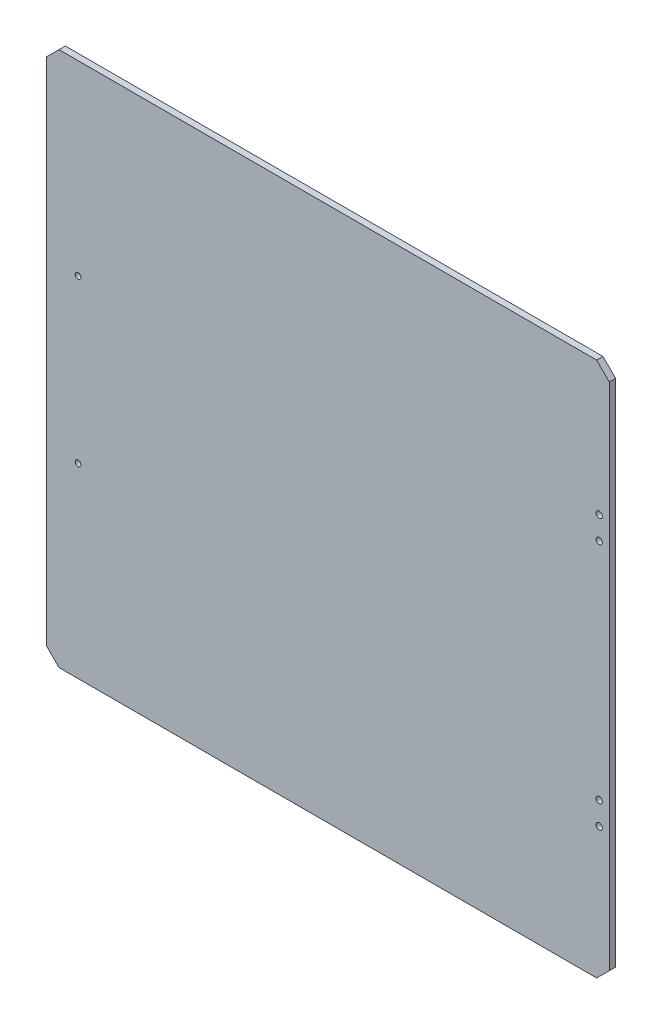
ISO-10303-21;
HEADER;
FILE_DESCRIPTION(('STEP AP214'),'2;1');
FILE_NAME('part.step','',(''),(''),'','','');
FILE_SCHEMA(('AUTOMOTIVE_DESIGN { 1 0 10303 214 1 1 1 1 }'));
ENDSEC;
DATA;
#1=APPLICATION_CONTEXT('core data for automotive mechanical design processes');
#2=APPLICATION_PROTOCOL_DEFINITION('international standard','automotive_design',2000,#1);
#3=PRODUCT_CONTEXT('',#1,'mechanical');
#4=PRODUCT('Part','Part','',(#3));
#5=PRODUCT_RELATED_PRODUCT_CATEGORY('part','',(#4));
#6=PRODUCT_DEFINITION_FORMATION('','',#4);
#7=PRODUCT_DEFINITION_CONTEXT('part definition',#1,'design');
#8=PRODUCT_DEFINITION('design','',#6,#7);
#9=PRODUCT_DEFINITION_SHAPE('','',#8);
#10=(LENGTH_UNIT() NAMED_UNIT(*) SI_UNIT(.MILLI.,.METRE.));
#11=(NAMED_UNIT(*) PLANE_ANGLE_UNIT() SI_UNIT($,.RADIAN.));
#12=(NAMED_UNIT(*) SI_UNIT($,.STERADIAN.) SOLID_ANGLE_UNIT());
#13=UNCERTAINTY_MEASURE_WITH_UNIT(LENGTH_MEASURE(1.E-05),#10,'distance_accuracy_value','');
#14=(GEOMETRIC_REPRESENTATION_CONTEXT(3) GLOBAL_UNCERTAINTY_ASSIGNED_CONTEXT((#13)) GLOBAL_UNIT_ASSIGNED_CONTEXT((#10,
#11,#12)) REPRESENTATION_CONTEXT('',''));
#15=CARTESIAN_POINT('',(0.,0.,0.));
#16=DIRECTION('',(0.,0.,1.));
#17=DIRECTION('',(1.,0.,0.));
#18=AXIS2_PLACEMENT_3D('',#15,#16,#17);
#19=CARTESIAN_POINT('',(0.,0.,5.));
#20=DIRECTION('',(0.,0.,1.));
#21=DIRECTION('',(1.,0.,0.));
#22=AXIS2_PLACEMENT_3D('',#19,#20,#21);
#23=PLANE('',#22);
#24=CARTESIAN_POINT('',(-197.,64.,5.));
#25=DIRECTION('',(0.,0.,1.));
#26=DIRECTION('',(1.,0.,0.));
#27=AXIS2_PLACEMENT_3D('',#24,#25,#26);
#28=CIRCLE('',#27,2.25000000000001);
#29=CARTESIAN_POINT('',(-194.75,64.,5.));
#30=VERTEX_POINT('',#29);
#31=EDGE_CURVE('E202',#30,#30,#28,.T.);
#32=ORIENTED_EDGE('',*,*,#31,.F.);
#33=EDGE_LOOP('',(#32));
#34=FACE_BOUND('',#33,.T.);
#35=CARTESIAN_POINT('',(214.,-88.4404340682116,5.));
#36=DIRECTION('',(0.,0.,1.));
#37=DIRECTION('',(-1.,0.,0.));
#38=AXIS2_PLACEMENT_3D('',#35,#36,#37);
#39=CIRCLE('',#38,2.5);
#40=CARTESIAN_POINT('',(211.5,-88.4404340682116,5.));
#41=VERTEX_POINT('',#40);
#42=EDGE_CURVE('E190',#41,#41,#39,.T.);
#43=ORIENTED_EDGE('',*,*,#42,.F.);
#44=EDGE_LOOP('',(#43));
#45=FACE_BOUND('',#44,.T.);
#46=CARTESIAN_POINT('',(214.,106.440434068212,5.));
#47=DIRECTION('',(0.,0.,1.));
#48=DIRECTION('',(1.,0.,0.));
#49=AXIS2_PLACEMENT_3D('',#46,#47,#48);
#50=CIRCLE('',#49,2.5);
#51=CARTESIAN_POINT('',(216.5,106.440434068212,5.));
#52=VERTEX_POINT('',#51);
#53=EDGE_CURVE('E136',#52,#52,#50,.T.);
#54=ORIENTED_EDGE('',*,*,#53,.F.);
#55=EDGE_LOOP('',(#54));
#56=FACE_BOUND('',#55,.T.);
#57=DIRECTION('',(0.,-1.,0.));
#58=VECTOR('',#57,1.);
#59=CARTESIAN_POINT('',(-222.,-201.,5.));
#60=LINE('',#59,#58);
#61=CARTESIAN_POINT('',(-222.,201.,5.));
#62=VERTEX_POINT('',#61);
#63=CARTESIAN_POINT('',(-222.,-201.,5.));
#64=VERTEX_POINT('',#63);
#65=EDGE_CURVE('E147',#62,#64,#60,.T.);
#66=ORIENTED_EDGE('',*,*,#65,.T.);
#67=DIRECTION('',(0.707106781186547,-0.707106781186547,0.));
#68=VECTOR('',#67,1.);
#69=CARTESIAN_POINT('',(-212.,-211.,5.));
#70=LINE('',#69,#68);
#71=CARTESIAN_POINT('',(-212.,-211.,5.));
#72=VERTEX_POINT('',#71);
#73=EDGE_CURVE('E95',#64,#72,#70,.T.);
#74=ORIENTED_EDGE('',*,*,#73,.T.);
#75=DIRECTION('',(1.,0.,0.));
#76=VECTOR('',#75,1.);
#77=CARTESIAN_POINT('',(212.,-211.,5.));
#78=LINE('',#77,#76);
#79=CARTESIAN_POINT('',(212.,-211.,5.));
#80=VERTEX_POINT('',#79);
#81=EDGE_CURVE('E162',#72,#80,#78,.T.);
#82=ORIENTED_EDGE('',*,*,#81,.T.);
#83=DIRECTION('',(0.707106781186547,0.707106781186547,0.));
#84=VECTOR('',#83,1.);
#85=CARTESIAN_POINT('',(212.,-211.,5.));
#86=LINE('',#85,#84);
#87=CARTESIAN_POINT('',(222.,-201.,5.));
#88=VERTEX_POINT('',#87);
#89=EDGE_CURVE('E175',#80,#88,#86,.T.);
#90=ORIENTED_EDGE('',*,*,#89,.T.);
#91=DIRECTION('',(0.,1.,0.));
#92=VECTOR('',#91,1.);
#93=CARTESIAN_POINT('',(222.,-201.,5.));
#94=LINE('',#93,#92);
#95=CARTESIAN_POINT('',(222.,201.,5.));
#96=VERTEX_POINT('',#95);
#97=EDGE_CURVE('E114',#88,#96,#94,.T.);
#98=ORIENTED_EDGE('',*,*,#97,.T.);
#99=DIRECTION('',(-0.707106781186547,0.707106781186547,0.));
#100=VECTOR('',#99,1.);
#101=CARTESIAN_POINT('',(222.,201.,5.));
#102=LINE('',#101,#100);
#103=CARTESIAN_POINT('',(212.,211.,5.));
#104=VERTEX_POINT('',#103);
#105=EDGE_CURVE('E108',#96,#104,#102,.T.);
#106=ORIENTED_EDGE('',*,*,#105,.T.);
#107=DIRECTION('',(-1.,0.,0.));
#108=VECTOR('',#107,1.);
#109=CARTESIAN_POINT('',(212.,211.,5.));
#110=LINE('',#109,#108);
#111=CARTESIAN_POINT('',(-212.,211.,5.));
#112=VERTEX_POINT('',#111);
#113=EDGE_CURVE('E112',#104,#112,#110,.T.);
#114=ORIENTED_EDGE('',*,*,#113,.T.);
#115=DIRECTION('',(-0.707106781186547,-0.707106781186547,0.));
#116=VECTOR('',#115,1.);
#117=CARTESIAN_POINT('',(-222.,201.,5.));
#118=LINE('',#117,#116);
#119=EDGE_CURVE('E52',#112,#62,#118,.T.);
#120=ORIENTED_EDGE('',*,*,#119,.T.);
#121=EDGE_LOOP('',(#66,#74,#82,#90,#98,#106,#114,#120));
#122=FACE_BOUND('',#121,.T.);
#123=CARTESIAN_POINT('',(214.,88.4404340682115,5.));
#124=DIRECTION('',(0.,0.,1.));
#125=DIRECTION('',(1.,0.,0.));
#126=AXIS2_PLACEMENT_3D('',#123,#124,#125);
#127=CIRCLE('',#126,2.5);
#128=CARTESIAN_POINT('',(216.5,88.4404340682115,5.));
#129=VERTEX_POINT('',#128);
#130=EDGE_CURVE('E184',#129,#129,#127,.T.);
#131=ORIENTED_EDGE('',*,*,#130,.F.);
#132=EDGE_LOOP('',(#131));
#133=FACE_BOUND('',#132,.T.);
#134=CARTESIAN_POINT('',(214.,-106.440434068212,5.));
#135=DIRECTION('',(0.,0.,1.));
#136=DIRECTION('',(-1.,0.,0.));
#137=AXIS2_PLACEMENT_3D('',#134,#135,#136);
#138=CIRCLE('',#137,2.5);
#139=CARTESIAN_POINT('',(211.5,-106.440434068212,5.));
#140=VERTEX_POINT('',#139);
#141=EDGE_CURVE('E196',#140,#140,#138,.T.);
#142=ORIENTED_EDGE('',*,*,#141,.F.);
#143=EDGE_LOOP('',(#142));
#144=FACE_BOUND('',#143,.T.);
#145=CARTESIAN_POINT('',(-197.,-64.,5.));
#146=DIRECTION('',(0.,0.,1.));
#147=DIRECTION('',(-1.,0.,0.));
#148=AXIS2_PLACEMENT_3D('',#145,#146,#147);
#149=CIRCLE('',#148,2.25000000000001);
#150=CARTESIAN_POINT('',(-199.25,-64.,5.));
#151=VERTEX_POINT('',#150);
#152=EDGE_CURVE('E208',#151,#151,#149,.T.);
#153=ORIENTED_EDGE('',*,*,#152,.F.);
#154=EDGE_LOOP('',(#153));
#155=FACE_BOUND('',#154,.T.);
#156=ADVANCED_FACE('F35',(#34,#45,#56,#122,#133,#144,#155),#23,.T.);
#157=CARTESIAN_POINT('',(0.,0.,0.));
#158=DIRECTION('',(0.,0.,1.));
#159=DIRECTION('',(1.,0.,0.));
#160=AXIS2_PLACEMENT_3D('',#157,#158,#159);
#161=PLANE('',#160);
#162=CARTESIAN_POINT('',(-197.,64.,0.));
#163=DIRECTION('',(0.,0.,1.));
#164=DIRECTION('',(1.,0.,0.));
#165=AXIS2_PLACEMENT_3D('',#162,#163,#164);
#166=CIRCLE('',#165,2.25000000000001);
#167=CARTESIAN_POINT('',(-194.75,64.,0.));
#168=VERTEX_POINT('',#167);
#169=EDGE_CURVE('E205',#168,#168,#166,.T.);
#170=ORIENTED_EDGE('',*,*,#169,.T.);
#171=EDGE_LOOP('',(#170));
#172=FACE_BOUND('',#171,.T.);
#173=CARTESIAN_POINT('',(214.,-88.4404340682116,0.));
#174=DIRECTION('',(0.,0.,1.));
#175=DIRECTION('',(-1.,0.,0.));
#176=AXIS2_PLACEMENT_3D('',#173,#174,#175);
#177=CIRCLE('',#176,2.5);
#178=CARTESIAN_POINT('',(211.5,-88.4404340682116,0.));
#179=VERTEX_POINT('',#178);
#180=EDGE_CURVE('E193',#179,#179,#177,.T.);
#181=ORIENTED_EDGE('',*,*,#180,.T.);
#182=EDGE_LOOP('',(#181));
#183=FACE_BOUND('',#182,.T.);
#184=CARTESIAN_POINT('',(214.,106.440434068212,0.));
#185=DIRECTION('',(0.,0.,1.));
#186=DIRECTION('',(1.,0.,0.));
#187=AXIS2_PLACEMENT_3D('',#184,#185,#186);
#188=CIRCLE('',#187,2.5);
#189=CARTESIAN_POINT('',(216.5,106.440434068212,0.));
#190=VERTEX_POINT('',#189);
#191=EDGE_CURVE('E181',#190,#190,#188,.T.);
#192=ORIENTED_EDGE('',*,*,#191,.T.);
#193=EDGE_LOOP('',(#192));
#194=FACE_BOUND('',#193,.T.);
#195=DIRECTION('',(0.,-1.,0.));
#196=VECTOR('',#195,1.);
#197=CARTESIAN_POINT('',(-222.,-201.,0.));
#198=LINE('',#197,#196);
#199=CARTESIAN_POINT('',(-222.,201.,0.));
#200=VERTEX_POINT('',#199);
#201=CARTESIAN_POINT('',(-222.,-201.,0.));
#202=VERTEX_POINT('',#201);
#203=EDGE_CURVE('E132',#200,#202,#198,.T.);
#204=ORIENTED_EDGE('',*,*,#203,.F.);
#205=DIRECTION('',(-0.707106781186547,-0.707106781186547,0.));
#206=VECTOR('',#205,1.);
#207=CARTESIAN_POINT('',(-222.,201.,0.));
#208=LINE('',#207,#206);
#209=CARTESIAN_POINT('',(-212.,211.,0.));
#210=VERTEX_POINT('',#209);
#211=EDGE_CURVE('E87',#210,#200,#208,.T.);
#212=ORIENTED_EDGE('',*,*,#211,.F.);
#213=DIRECTION('',(-1.,0.,0.));
#214=VECTOR('',#213,1.);
#215=CARTESIAN_POINT('',(212.,211.,0.));
#216=LINE('',#215,#214);
#217=CARTESIAN_POINT('',(212.,211.,0.));
#218=VERTEX_POINT('',#217);
#219=EDGE_CURVE('E81',#218,#210,#216,.T.);
#220=ORIENTED_EDGE('',*,*,#219,.F.);
#221=DIRECTION('',(-0.707106781186547,0.707106781186547,0.));
#222=VECTOR('',#221,1.);
#223=CARTESIAN_POINT('',(222.,201.,0.));
#224=LINE('',#223,#222);
#225=CARTESIAN_POINT('',(222.,201.,0.));
#226=VERTEX_POINT('',#225);
#227=EDGE_CURVE('E122',#226,#218,#224,.T.);
#228=ORIENTED_EDGE('',*,*,#227,.F.);
#229=DIRECTION('',(0.,1.,0.));
#230=VECTOR('',#229,1.);
#231=CARTESIAN_POINT('',(222.,-201.,0.));
#232=LINE('',#231,#230);
#233=CARTESIAN_POINT('',(222.,-201.,0.));
#234=VERTEX_POINT('',#233);
#235=EDGE_CURVE('E142',#234,#226,#232,.T.);
#236=ORIENTED_EDGE('',*,*,#235,.F.);
#237=DIRECTION('',(0.707106781186547,0.707106781186547,0.));
#238=VECTOR('',#237,1.);
#239=CARTESIAN_POINT('',(212.,-211.,0.));
#240=LINE('',#239,#238);
#241=CARTESIAN_POINT('',(212.,-211.,0.));
#242=VERTEX_POINT('',#241);
#243=EDGE_CURVE('E140',#242,#234,#240,.T.);
#244=ORIENTED_EDGE('',*,*,#243,.F.);
#245=DIRECTION('',(1.,0.,0.));
#246=VECTOR('',#245,1.);
#247=CARTESIAN_POINT('',(212.,-211.,0.));
#248=LINE('',#247,#246);
#249=CARTESIAN_POINT('',(-212.,-211.,0.));
#250=VERTEX_POINT('',#249);
#251=EDGE_CURVE('E138',#250,#242,#248,.T.);
#252=ORIENTED_EDGE('',*,*,#251,.F.);
#253=DIRECTION('',(0.707106781186547,-0.707106781186547,0.));
#254=VECTOR('',#253,1.);
#255=CARTESIAN_POINT('',(-212.,-211.,0.));
#256=LINE('',#255,#254);
#257=EDGE_CURVE('E135',#202,#250,#256,.T.);
#258=ORIENTED_EDGE('',*,*,#257,.F.);
#259=EDGE_LOOP('',(#204,#212,#220,#228,#236,#244,#252,#258));
#260=FACE_BOUND('',#259,.T.);
#261=CARTESIAN_POINT('',(214.,88.4404340682115,0.));
#262=DIRECTION('',(0.,0.,1.));
#263=DIRECTION('',(1.,0.,0.));
#264=AXIS2_PLACEMENT_3D('',#261,#262,#263);
#265=CIRCLE('',#264,2.5);
#266=CARTESIAN_POINT('',(216.5,88.4404340682115,0.));
#267=VERTEX_POINT('',#266);
#268=EDGE_CURVE('E187',#267,#267,#265,.T.);
#269=ORIENTED_EDGE('',*,*,#268,.T.);
#270=EDGE_LOOP('',(#269));
#271=FACE_BOUND('',#270,.T.);
#272=CARTESIAN_POINT('',(214.,-106.440434068212,0.));
#273=DIRECTION('',(0.,0.,1.));
#274=DIRECTION('',(-1.,0.,0.));
#275=AXIS2_PLACEMENT_3D('',#272,#273,#274);
#276=CIRCLE('',#275,2.5);
#277=CARTESIAN_POINT('',(211.5,-106.440434068212,0.));
#278=VERTEX_POINT('',#277);
#279=EDGE_CURVE('E199',#278,#278,#276,.T.);
#280=ORIENTED_EDGE('',*,*,#279,.T.);
#281=EDGE_LOOP('',(#280));
#282=FACE_BOUND('',#281,.T.);
#283=CARTESIAN_POINT('',(-197.,-64.,0.));
#284=DIRECTION('',(0.,0.,1.));
#285=DIRECTION('',(-1.,0.,0.));
#286=AXIS2_PLACEMENT_3D('',#283,#284,#285);
#287=CIRCLE('',#286,2.25000000000001);
#288=CARTESIAN_POINT('',(-199.25,-64.,0.));
#289=VERTEX_POINT('',#288);
#290=EDGE_CURVE('E211',#289,#289,#287,.T.);
#291=ORIENTED_EDGE('',*,*,#290,.T.);
#292=EDGE_LOOP('',(#291));
#293=FACE_BOUND('',#292,.T.);
#294=ADVANCED_FACE('F166',(#172,#183,#194,#260,#271,#282,#293),#161,.F.);
#295=CARTESIAN_POINT('',(-222.,-201.,5.));
#296=DIRECTION('',(1.,0.,0.));
#297=DIRECTION('',(0.,0.,-1.));
#298=AXIS2_PLACEMENT_3D('',#295,#296,#297);
#299=PLANE('',#298);
#300=ORIENTED_EDGE('',*,*,#203,.T.);
#301=DIRECTION('',(0.,0.,-1.));
#302=VECTOR('',#301,1.);
#303=CARTESIAN_POINT('',(-222.,-201.,5.));
#304=LINE('',#303,#302);
#305=EDGE_CURVE('E11',#64,#202,#304,.T.);
#306=ORIENTED_EDGE('',*,*,#305,.F.);
#307=ORIENTED_EDGE('',*,*,#65,.F.);
#308=DIRECTION('',(0.,0.,-1.));
#309=VECTOR('',#308,1.);
#310=CARTESIAN_POINT('',(-222.,201.,5.));
#311=LINE('',#310,#309);
#312=EDGE_CURVE('E128',#62,#200,#311,.T.);
#313=ORIENTED_EDGE('',*,*,#312,.T.);
#314=EDGE_LOOP('',(#300,#306,#307,#313));
#315=FACE_BOUND('',#314,.T.);
#316=ADVANCED_FACE('F37',(#315),#299,.F.);
#317=CARTESIAN_POINT('',(-212.,-211.,5.));
#318=DIRECTION('',(0.707106781186548,0.707106781186548,0.));
#319=DIRECTION('',(-0.707106781186548,0.707106781186548,0.));
#320=AXIS2_PLACEMENT_3D('',#317,#318,#319);
#321=PLANE('',#320);
#322=ORIENTED_EDGE('',*,*,#257,.T.);
#323=DIRECTION('',(0.,0.,-1.));
#324=VECTOR('',#323,1.);
#325=CARTESIAN_POINT('',(-212.,-211.,5.));
#326=LINE('',#325,#324);
#327=EDGE_CURVE('E44',#72,#250,#326,.T.);
#328=ORIENTED_EDGE('',*,*,#327,.F.);
#329=ORIENTED_EDGE('',*,*,#73,.F.);
#330=ORIENTED_EDGE('',*,*,#305,.T.);
#331=EDGE_LOOP('',(#322,#328,#329,#330));
#332=FACE_BOUND('',#331,.T.);
#333=ADVANCED_FACE('F246',(#332),#321,.F.);
#334=CARTESIAN_POINT('',(212.,-211.,5.));
#335=DIRECTION('',(0.,1.,0.));
#336=DIRECTION('',(-1.,0.,0.));
#337=AXIS2_PLACEMENT_3D('',#334,#335,#336);
#338=PLANE('',#337);
#339=ORIENTED_EDGE('',*,*,#251,.T.);
#340=DIRECTION('',(0.,0.,-1.));
#341=VECTOR('',#340,1.);
#342=CARTESIAN_POINT('',(212.,-211.,5.));
#343=LINE('',#342,#341);
#344=EDGE_CURVE('E154',#80,#242,#343,.T.);
#345=ORIENTED_EDGE('',*,*,#344,.F.);
#346=ORIENTED_EDGE('',*,*,#81,.F.);
#347=ORIENTED_EDGE('',*,*,#327,.T.);
#348=EDGE_LOOP('',(#339,#345,#346,#347));
#349=FACE_BOUND('',#348,.T.);
#350=ADVANCED_FACE('F160',(#349),#338,.F.);
#351=CARTESIAN_POINT('',(212.,-211.,5.));
#352=DIRECTION('',(-0.707106781186548,0.707106781186548,0.));
#353=DIRECTION('',(-0.707106781186548,-0.707106781186548,0.));
#354=AXIS2_PLACEMENT_3D('',#351,#352,#353);
#355=PLANE('',#354);
#356=ORIENTED_EDGE('',*,*,#243,.T.);
#357=DIRECTION('',(0.,0.,-1.));
#358=VECTOR('',#357,1.);
#359=CARTESIAN_POINT('',(222.,-201.,5.));
#360=LINE('',#359,#358);
#361=EDGE_CURVE('E151',#88,#234,#360,.T.);
#362=ORIENTED_EDGE('',*,*,#361,.F.);
#363=ORIENTED_EDGE('',*,*,#89,.F.);
#364=ORIENTED_EDGE('',*,*,#344,.T.);
#365=EDGE_LOOP('',(#356,#362,#363,#364));
#366=FACE_BOUND('',#365,.T.);
#367=ADVANCED_FACE('F171',(#366),#355,.F.);
#368=CARTESIAN_POINT('',(222.,-201.,5.));
#369=DIRECTION('',(-1.,0.,0.));
#370=DIRECTION('',(0.,0.,1.));
#371=AXIS2_PLACEMENT_3D('',#368,#369,#370);
#372=PLANE('',#371);
#373=ORIENTED_EDGE('',*,*,#235,.T.);
#374=DIRECTION('',(0.,0.,-1.));
#375=VECTOR('',#374,1.);
#376=CARTESIAN_POINT('',(222.,201.,5.));
#377=LINE('',#376,#375);
#378=EDGE_CURVE('E123',#96,#226,#377,.T.);
#379=ORIENTED_EDGE('',*,*,#378,.F.);
#380=ORIENTED_EDGE('',*,*,#97,.F.);
#381=ORIENTED_EDGE('',*,*,#361,.T.);
#382=EDGE_LOOP('',(#373,#379,#380,#381));
#383=FACE_BOUND('',#382,.T.);
#384=ADVANCED_FACE('F174',(#383),#372,.F.);
#385=CARTESIAN_POINT('',(222.,201.,5.));
#386=DIRECTION('',(-0.707106781186548,-0.707106781186548,0.));
#387=DIRECTION('',(0.707106781186548,-0.707106781186548,0.));
#388=AXIS2_PLACEMENT_3D('',#385,#386,#387);
#389=PLANE('',#388);
#390=ORIENTED_EDGE('',*,*,#227,.T.);
#391=DIRECTION('',(0.,0.,-1.));
#392=VECTOR('',#391,1.);
#393=CARTESIAN_POINT('',(212.,211.,5.));
#394=LINE('',#393,#392);
#395=EDGE_CURVE('E119',#104,#218,#394,.T.);
#396=ORIENTED_EDGE('',*,*,#395,.F.);
#397=ORIENTED_EDGE('',*,*,#105,.F.);
#398=ORIENTED_EDGE('',*,*,#378,.T.);
#399=EDGE_LOOP('',(#390,#396,#397,#398));
#400=FACE_BOUND('',#399,.T.);
#401=ADVANCED_FACE('F120',(#400),#389,.F.);
#402=CARTESIAN_POINT('',(212.,211.,5.));
#403=DIRECTION('',(0.,-1.,0.));
#404=DIRECTION('',(1.,0.,0.));
#405=AXIS2_PLACEMENT_3D('',#402,#403,#404);
#406=PLANE('',#405);
#407=ORIENTED_EDGE('',*,*,#219,.T.);
#408=DIRECTION('',(0.,0.,-1.));
#409=VECTOR('',#408,1.);
#410=CARTESIAN_POINT('',(-212.,211.,5.));
#411=LINE('',#410,#409);
#412=EDGE_CURVE('E124',#112,#210,#411,.T.);
#413=ORIENTED_EDGE('',*,*,#412,.F.);
#414=ORIENTED_EDGE('',*,*,#113,.F.);
#415=ORIENTED_EDGE('',*,*,#395,.T.);
#416=EDGE_LOOP('',(#407,#413,#414,#415));
#417=FACE_BOUND('',#416,.T.);
#418=ADVANCED_FACE('F126',(#417),#406,.F.);
#419=CARTESIAN_POINT('',(-222.,201.,5.));
#420=DIRECTION('',(0.707106781186548,-0.707106781186548,0.));
#421=DIRECTION('',(0.707106781186548,0.707106781186548,0.));
#422=AXIS2_PLACEMENT_3D('',#419,#420,#421);
#423=PLANE('',#422);
#424=ORIENTED_EDGE('',*,*,#211,.T.);
#425=ORIENTED_EDGE('',*,*,#312,.F.);
#426=ORIENTED_EDGE('',*,*,#119,.F.);
#427=ORIENTED_EDGE('',*,*,#412,.T.);
#428=EDGE_LOOP('',(#424,#425,#426,#427));
#429=FACE_BOUND('',#428,.T.);
#430=ADVANCED_FACE('F234',(#429),#423,.F.);
#431=CARTESIAN_POINT('',(214.,106.440434068212,5.));
#432=DIRECTION('',(0.,0.,-1.));
#433=DIRECTION('',(-1.,0.,0.));
#434=AXIS2_PLACEMENT_3D('',#431,#432,#433);
#435=CYLINDRICAL_SURFACE('',#434,2.5);
#436=ORIENTED_EDGE('',*,*,#53,.T.);
#437=EDGE_LOOP('',(#436));
#438=FACE_BOUND('',#437,.T.);
#439=ORIENTED_EDGE('',*,*,#191,.F.);
#440=EDGE_LOOP('',(#439));
#441=FACE_BOUND('',#440,.T.);
#442=ADVANCED_FACE('F231',(#438,#441),#435,.F.);
#443=CARTESIAN_POINT('',(214.,88.4404340682115,5.));
#444=DIRECTION('',(0.,0.,-1.));
#445=DIRECTION('',(-1.,0.,0.));
#446=AXIS2_PLACEMENT_3D('',#443,#444,#445);
#447=CYLINDRICAL_SURFACE('',#446,2.5);
#448=ORIENTED_EDGE('',*,*,#130,.T.);
#449=EDGE_LOOP('',(#448));
#450=FACE_BOUND('',#449,.T.);
#451=ORIENTED_EDGE('',*,*,#268,.F.);
#452=EDGE_LOOP('',(#451));
#453=FACE_BOUND('',#452,.T.);
#454=ADVANCED_FACE('F310',(#450,#453),#447,.F.);
#455=CARTESIAN_POINT('',(214.,-88.4404340682116,5.));
#456=DIRECTION('',(0.,0.,-1.));
#457=DIRECTION('',(-1.,0.,0.));
#458=AXIS2_PLACEMENT_3D('',#455,#456,#457);
#459=CYLINDRICAL_SURFACE('',#458,2.5);
#460=ORIENTED_EDGE('',*,*,#42,.T.);
#461=EDGE_LOOP('',(#460));
#462=FACE_BOUND('',#461,.T.);
#463=ORIENTED_EDGE('',*,*,#180,.F.);
#464=EDGE_LOOP('',(#463));
#465=FACE_BOUND('',#464,.T.);
#466=ADVANCED_FACE('F318',(#462,#465),#459,.F.);
#467=CARTESIAN_POINT('',(214.,-106.440434068212,5.));
#468=DIRECTION('',(0.,0.,-1.));
#469=DIRECTION('',(-1.,0.,0.));
#470=AXIS2_PLACEMENT_3D('',#467,#468,#469);
#471=CYLINDRICAL_SURFACE('',#470,2.5);
#472=ORIENTED_EDGE('',*,*,#141,.T.);
#473=EDGE_LOOP('',(#472));
#474=FACE_BOUND('',#473,.T.);
#475=ORIENTED_EDGE('',*,*,#279,.F.);
#476=EDGE_LOOP('',(#475));
#477=FACE_BOUND('',#476,.T.);
#478=ADVANCED_FACE('F326',(#474,#477),#471,.F.);
#479=CARTESIAN_POINT('',(-197.,64.,5.));
#480=DIRECTION('',(0.,0.,-1.));
#481=DIRECTION('',(-1.,0.,0.));
#482=AXIS2_PLACEMENT_3D('',#479,#480,#481);
#483=CYLINDRICAL_SURFACE('',#482,2.25000000000001);
#484=ORIENTED_EDGE('',*,*,#31,.T.);
#485=EDGE_LOOP('',(#484));
#486=FACE_BOUND('',#485,.T.);
#487=ORIENTED_EDGE('',*,*,#169,.F.);
#488=EDGE_LOOP('',(#487));
#489=FACE_BOUND('',#488,.T.);
#490=ADVANCED_FACE('F335',(#486,#489),#483,.F.);
#491=CARTESIAN_POINT('',(-197.,-64.,5.));
#492=DIRECTION('',(0.,0.,-1.));
#493=DIRECTION('',(-1.,0.,0.));
#494=AXIS2_PLACEMENT_3D('',#491,#492,#493);
#495=CYLINDRICAL_SURFACE('',#494,2.25000000000001);
#496=ORIENTED_EDGE('',*,*,#152,.T.);
#497=EDGE_LOOP('',(#496));
#498=FACE_BOUND('',#497,.T.);
#499=ORIENTED_EDGE('',*,*,#290,.F.);
#500=EDGE_LOOP('',(#499));
#501=FACE_BOUND('',#500,.T.);
#502=ADVANCED_FACE('F217',(#498,#501),#495,.F.);
#503=CLOSED_SHELL('',(#156,#294,#316,#333,#350,#367,#384,#401,#418,#430,#442,#454,#466,#478,
#490,#502));
#504=MANIFOLD_SOLID_BREP('B2',#503);
#505=ADVANCED_BREP_SHAPE_REPRESENTATION('',(#18,#504),#14);
#506=SHAPE_DEFINITION_REPRESENTATION(#9,#505);
ENDSEC;
END-ISO-10303-21;
